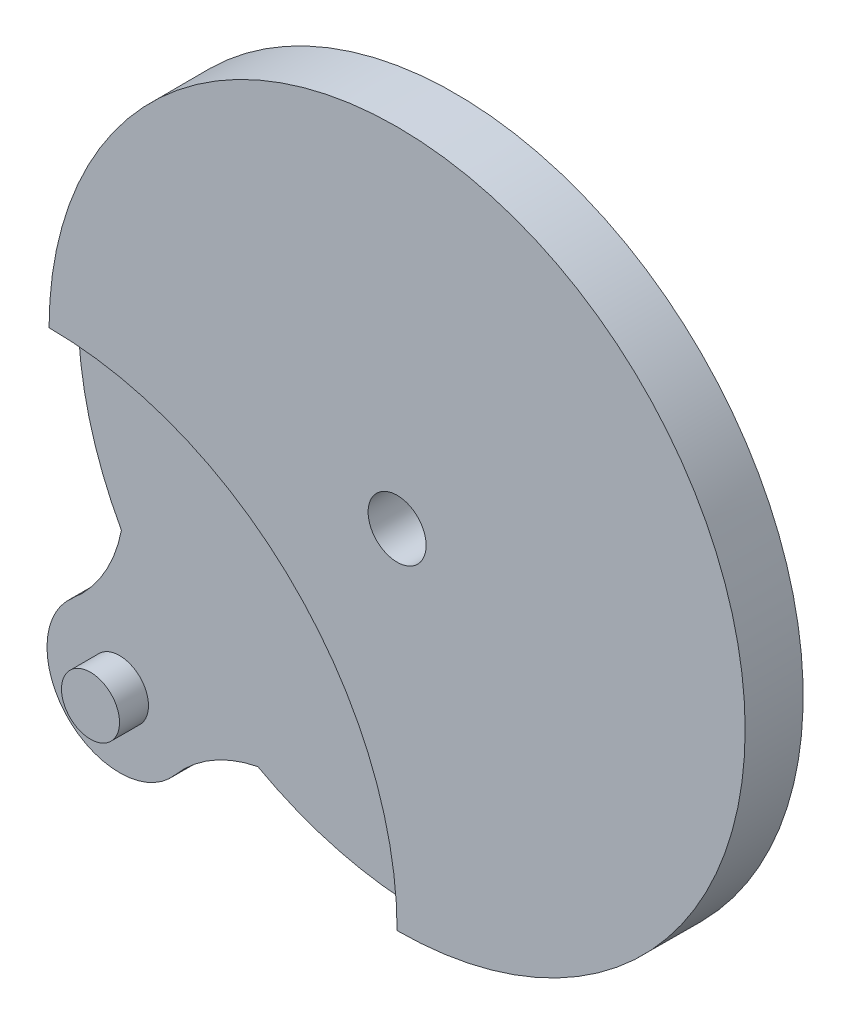
ISO-10303-21;
HEADER;
FILE_DESCRIPTION(('STEP AP214'),'2;1');
FILE_NAME('part.step','',(''),(''),'','','');
FILE_SCHEMA(('AUTOMOTIVE_DESIGN { 1 0 10303 214 1 1 1 1 }'));
ENDSEC;
DATA;
#1=APPLICATION_CONTEXT('core data for automotive mechanical design processes');
#2=APPLICATION_PROTOCOL_DEFINITION('international standard','automotive_design',2000,#1);
#3=PRODUCT_CONTEXT('',#1,'mechanical');
#4=PRODUCT('Part','Part','',(#3));
#5=PRODUCT_RELATED_PRODUCT_CATEGORY('part','',(#4));
#6=PRODUCT_DEFINITION_FORMATION('','',#4);
#7=PRODUCT_DEFINITION_CONTEXT('part definition',#1,'design');
#8=PRODUCT_DEFINITION('design','',#6,#7);
#9=PRODUCT_DEFINITION_SHAPE('','',#8);
#10=(LENGTH_UNIT() NAMED_UNIT(*) SI_UNIT(.MILLI.,.METRE.));
#11=(NAMED_UNIT(*) PLANE_ANGLE_UNIT() SI_UNIT($,.RADIAN.));
#12=(NAMED_UNIT(*) SI_UNIT($,.STERADIAN.) SOLID_ANGLE_UNIT());
#13=UNCERTAINTY_MEASURE_WITH_UNIT(LENGTH_MEASURE(1.E-05),#10,'distance_accuracy_value','');
#14=(GEOMETRIC_REPRESENTATION_CONTEXT(3) GLOBAL_UNCERTAINTY_ASSIGNED_CONTEXT((#13)) GLOBAL_UNIT_ASSIGNED_CONTEXT((#10,
#11,#12)) REPRESENTATION_CONTEXT('',''));
#15=CARTESIAN_POINT('',(0.,0.,0.));
#16=DIRECTION('',(0.,0.,1.));
#17=DIRECTION('',(1.,0.,0.));
#18=AXIS2_PLACEMENT_3D('',#15,#16,#17);
#19=CARTESIAN_POINT('',(0.,0.,10.));
#20=DIRECTION('',(0.,0.,-1.));
#21=DIRECTION('',(-1.,0.,0.));
#22=AXIS2_PLACEMENT_3D('',#19,#20,#21);
#23=CYLINDRICAL_SURFACE('',#22,5.);
#24=CARTESIAN_POINT('',(0.,0.,10.));
#25=DIRECTION('',(0.,0.,1.));
#26=DIRECTION('',(1.,0.,0.));
#27=AXIS2_PLACEMENT_3D('',#24,#25,#26);
#28=CIRCLE('',#27,5.);
#29=CARTESIAN_POINT('',(5.,0.,10.));
#30=VERTEX_POINT('',#29);
#31=EDGE_CURVE('E138',#30,#30,#28,.T.);
#32=ORIENTED_EDGE('',*,*,#31,.T.);
#33=EDGE_LOOP('',(#32));
#34=FACE_BOUND('',#33,.T.);
#35=CARTESIAN_POINT('',(0.,0.,0.));
#36=DIRECTION('',(0.,0.,1.));
#37=DIRECTION('',(1.,0.,0.));
#38=AXIS2_PLACEMENT_3D('',#35,#36,#37);
#39=CIRCLE('',#38,5.);
#40=CARTESIAN_POINT('',(5.,0.,0.));
#41=VERTEX_POINT('',#40);
#42=EDGE_CURVE('E136',#41,#41,#39,.T.);
#43=ORIENTED_EDGE('',*,*,#42,.F.);
#44=EDGE_LOOP('',(#43));
#45=FACE_BOUND('',#44,.T.);
#46=ADVANCED_FACE('F39',(#34,#45),#23,.F.);
#47=CARTESIAN_POINT('',(0.,0.,10.));
#48=DIRECTION('',(0.,0.,-1.));
#49=DIRECTION('',(-1.,0.,0.));
#50=AXIS2_PLACEMENT_3D('',#47,#48,#49);
#51=CYLINDRICAL_SURFACE('',#50,60.);
#52=CARTESIAN_POINT('',(0.,0.,0.));
#53=DIRECTION('',(0.,0.,1.));
#54=DIRECTION('',(1.,0.,0.));
#55=AXIS2_PLACEMENT_3D('',#52,#53,#54);
#56=CIRCLE('',#55,60.);
#57=CARTESIAN_POINT('',(-29.0017317235602,-52.5252278151618,0.));
#58=VERTEX_POINT('',#57);
#59=CARTESIAN_POINT('',(-52.5252278151621,-29.0017317235597,0.));
#60=VERTEX_POINT('',#59);
#61=EDGE_CURVE('E57',#58,#60,#56,.T.);
#62=ORIENTED_EDGE('',*,*,#61,.T.);
#63=DIRECTION('',(0.,0.,-1.));
#64=VECTOR('',#63,1.);
#65=CARTESIAN_POINT('',(-52.5252278151625,-29.0017317235599,5.));
#66=LINE('',#65,#64);
#67=CARTESIAN_POINT('',(-52.5252278151625,-29.0017317235599,5.));
#68=VERTEX_POINT('',#67);
#69=EDGE_CURVE('E101',#68,#60,#66,.T.);
#70=ORIENTED_EDGE('',*,*,#69,.F.);
#71=CARTESIAN_POINT('',(0.,0.,5.));
#72=DIRECTION('',(0.,0.,-1.));
#73=DIRECTION('',(-1.,0.,0.));
#74=AXIS2_PLACEMENT_3D('',#71,#72,#73);
#75=CIRCLE('',#74,60.);
#76=CARTESIAN_POINT('',(-60.,0.,5.));
#77=VERTEX_POINT('',#76);
#78=EDGE_CURVE('E90',#68,#77,#75,.T.);
#79=ORIENTED_EDGE('',*,*,#78,.T.);
#80=DIRECTION('',(0.,0.,1.));
#81=VECTOR('',#80,1.);
#82=CARTESIAN_POINT('',(-60.,0.,5.));
#83=LINE('',#82,#81);
#84=CARTESIAN_POINT('',(-60.,0.,10.));
#85=VERTEX_POINT('',#84);
#86=EDGE_CURVE('E132',#77,#85,#83,.T.);
#87=ORIENTED_EDGE('',*,*,#86,.T.);
#88=CARTESIAN_POINT('',(0.,0.,10.));
#89=DIRECTION('',(0.,0.,1.));
#90=DIRECTION('',(1.,0.,0.));
#91=AXIS2_PLACEMENT_3D('',#88,#89,#90);
#92=CIRCLE('',#91,60.);
#93=CARTESIAN_POINT('',(0.,-60.,10.));
#94=VERTEX_POINT('',#93);
#95=EDGE_CURVE('E100',#94,#85,#92,.T.);
#96=ORIENTED_EDGE('',*,*,#95,.F.);
#97=DIRECTION('',(0.,0.,1.));
#98=VECTOR('',#97,1.);
#99=CARTESIAN_POINT('',(0.,-60.,5.));
#100=LINE('',#99,#98);
#101=CARTESIAN_POINT('',(0.,-60.,5.));
#102=VERTEX_POINT('',#101);
#103=EDGE_CURVE('E134',#102,#94,#100,.T.);
#104=ORIENTED_EDGE('',*,*,#103,.F.);
#105=CARTESIAN_POINT('',(-29.0017317235602,-52.5252278151618,5.));
#106=VERTEX_POINT('',#105);
#107=EDGE_CURVE('E46',#102,#106,#75,.T.);
#108=ORIENTED_EDGE('',*,*,#107,.T.);
#109=DIRECTION('',(0.,0.,-1.));
#110=VECTOR('',#109,1.);
#111=CARTESIAN_POINT('',(-29.0017317235602,-52.5252278151619,5.));
#112=LINE('',#111,#110);
#113=EDGE_CURVE('E53',#106,#58,#112,.T.);
#114=ORIENTED_EDGE('',*,*,#113,.T.);
#115=EDGE_LOOP('',(#62,#70,#79,#87,#96,#104,#108,#114));
#116=FACE_BOUND('',#115,.T.);
#117=ADVANCED_FACE('F102',(#116),#51,.T.);
#118=CARTESIAN_POINT('',(0.,0.,10.));
#119=DIRECTION('',(0.,0.,1.));
#120=DIRECTION('',(1.,0.,0.));
#121=AXIS2_PLACEMENT_3D('',#118,#119,#120);
#122=PLANE('',#121);
#123=CARTESIAN_POINT('',(-60.,-60.,10.));
#124=DIRECTION('',(0.,0.,1.));
#125=DIRECTION('',(-1.,0.,0.));
#126=AXIS2_PLACEMENT_3D('',#123,#124,#125);
#127=CIRCLE('',#126,60.);
#128=EDGE_CURVE('E127',#94,#85,#127,.T.);
#129=ORIENTED_EDGE('',*,*,#128,.F.);
#130=ORIENTED_EDGE('',*,*,#95,.T.);
#131=EDGE_LOOP('',(#129,#130));
#132=FACE_BOUND('',#131,.T.);
#133=ORIENTED_EDGE('',*,*,#31,.F.);
#134=EDGE_LOOP('',(#133));
#135=FACE_BOUND('',#134,.T.);
#136=ADVANCED_FACE('F157',(#132,#135),#122,.T.);
#137=CARTESIAN_POINT('',(0.,0.,0.));
#138=DIRECTION('',(0.,0.,1.));
#139=DIRECTION('',(1.,0.,0.));
#140=AXIS2_PLACEMENT_3D('',#137,#138,#139);
#141=PLANE('',#140);
#142=ORIENTED_EDGE('',*,*,#42,.T.);
#143=EDGE_LOOP('',(#142));
#144=FACE_BOUND('',#143,.T.);
#145=ORIENTED_EDGE('',*,*,#61,.F.);
#146=CARTESIAN_POINT('',(-24.2154792278154,-77.0627865170166,0.));
#147=DIRECTION('',(0.,0.,1.));
#148=DIRECTION('',(-1.,0.,0.));
#149=AXIS2_PLACEMENT_3D('',#146,#147,#148);
#150=CIRCLE('',#149,24.9999999999998);
#151=CARTESIAN_POINT('',(-43.3093143384008,-60.9250834348021,0.));
#152=VERTEX_POINT('',#151);
#153=EDGE_CURVE('E116',#58,#152,#150,.T.);
#154=ORIENTED_EDGE('',*,*,#153,.T.);
#155=CARTESIAN_POINT('',(-52.8562318936947,-52.8562318936941,0.));
#156=DIRECTION('',(0.,0.,-1.));
#157=DIRECTION('',(-1.,0.,0.));
#158=AXIS2_PLACEMENT_3D('',#155,#156,#157);
#159=CIRCLE('',#158,12.5000000000008);
#160=CARTESIAN_POINT('',(-60.9250834348031,-43.3093143384006,0.));
#161=VERTEX_POINT('',#160);
#162=EDGE_CURVE('E111',#152,#161,#159,.T.);
#163=ORIENTED_EDGE('',*,*,#162,.T.);
#164=CARTESIAN_POINT('',(-77.0627865170168,-24.2154792278139,0.));
#165=DIRECTION('',(0.,0.,1.));
#166=DIRECTION('',(1.,0.,0.));
#167=AXIS2_PLACEMENT_3D('',#164,#165,#166);
#168=CIRCLE('',#167,24.9999999999992);
#169=EDGE_CURVE('E122',#161,#60,#168,.T.);
#170=ORIENTED_EDGE('',*,*,#169,.T.);
#171=EDGE_LOOP('',(#145,#154,#163,#170));
#172=FACE_BOUND('',#171,.T.);
#173=ADVANCED_FACE('F155',(#144,#172),#141,.F.);
#174=CARTESIAN_POINT('',(-60.,-60.,5.));
#175=DIRECTION('',(0.,0.,-1.));
#176=DIRECTION('',(-1.,0.,0.));
#177=AXIS2_PLACEMENT_3D('',#174,#175,#176);
#178=PLANE('',#177);
#179=CARTESIAN_POINT('',(-52.8562318936947,-52.8562318936941,5.));
#180=DIRECTION('',(0.,0.,-1.));
#181=DIRECTION('',(-1.,0.,0.));
#182=AXIS2_PLACEMENT_3D('',#179,#180,#181);
#183=CIRCLE('',#182,5.);
#184=CARTESIAN_POINT('',(-57.8562318936947,-52.8562318936941,5.));
#185=VERTEX_POINT('',#184);
#186=EDGE_CURVE('E11',#185,#185,#183,.F.);
#187=ORIENTED_EDGE('',*,*,#186,.F.);
#188=EDGE_LOOP('',(#187));
#189=FACE_BOUND('',#188,.T.);
#190=CARTESIAN_POINT('',(-60.,-60.,5.));
#191=DIRECTION('',(0.,0.,1.));
#192=DIRECTION('',(-1.,0.,0.));
#193=AXIS2_PLACEMENT_3D('',#190,#191,#192);
#194=CIRCLE('',#193,60.);
#195=EDGE_CURVE('E97',#102,#77,#194,.T.);
#196=ORIENTED_EDGE('',*,*,#195,.T.);
#197=ORIENTED_EDGE('',*,*,#78,.F.);
#198=CARTESIAN_POINT('',(-77.0627865170168,-24.2154792278139,5.));
#199=DIRECTION('',(0.,0.,1.));
#200=DIRECTION('',(1.,0.,0.));
#201=AXIS2_PLACEMENT_3D('',#198,#199,#200);
#202=CIRCLE('',#201,24.9999999999992);
#203=CARTESIAN_POINT('',(-60.9250834348031,-43.3093143384006,5.));
#204=VERTEX_POINT('',#203);
#205=EDGE_CURVE('E94',#204,#68,#202,.T.);
#206=ORIENTED_EDGE('',*,*,#205,.F.);
#207=CARTESIAN_POINT('',(-52.8562318936947,-52.8562318936941,5.));
#208=DIRECTION('',(0.,0.,-1.));
#209=DIRECTION('',(-1.,0.,0.));
#210=AXIS2_PLACEMENT_3D('',#207,#208,#209);
#211=CIRCLE('',#210,12.5000000000008);
#212=CARTESIAN_POINT('',(-43.3093143384008,-60.9250834348021,5.));
#213=VERTEX_POINT('',#212);
#214=EDGE_CURVE('E106',#213,#204,#211,.T.);
#215=ORIENTED_EDGE('',*,*,#214,.F.);
#216=CARTESIAN_POINT('',(-24.2154792278154,-77.0627865170166,5.));
#217=DIRECTION('',(0.,0.,1.));
#218=DIRECTION('',(-1.,0.,0.));
#219=AXIS2_PLACEMENT_3D('',#216,#217,#218);
#220=CIRCLE('',#219,24.9999999999998);
#221=EDGE_CURVE('E110',#106,#213,#220,.T.);
#222=ORIENTED_EDGE('',*,*,#221,.F.);
#223=ORIENTED_EDGE('',*,*,#107,.F.);
#224=EDGE_LOOP('',(#196,#197,#206,#215,#222,#223));
#225=FACE_BOUND('',#224,.T.);
#226=ADVANCED_FACE('F91',(#189,#225),#178,.F.);
#227=CARTESIAN_POINT('',(-60.,-60.,5.));
#228=DIRECTION('',(0.,0.,1.));
#229=DIRECTION('',(1.,0.,0.));
#230=AXIS2_PLACEMENT_3D('',#227,#228,#229);
#231=CYLINDRICAL_SURFACE('',#230,60.);
#232=ORIENTED_EDGE('',*,*,#128,.T.);
#233=ORIENTED_EDGE('',*,*,#86,.F.);
#234=ORIENTED_EDGE('',*,*,#195,.F.);
#235=ORIENTED_EDGE('',*,*,#103,.T.);
#236=EDGE_LOOP('',(#232,#233,#234,#235));
#237=FACE_BOUND('',#236,.T.);
#238=ADVANCED_FACE('F165',(#237),#231,.F.);
#239=CARTESIAN_POINT('',(-77.0627865170168,-24.2154792278139,5.));
#240=DIRECTION('',(0.,0.,-1.));
#241=DIRECTION('',(-1.,0.,0.));
#242=AXIS2_PLACEMENT_3D('',#239,#240,#241);
#243=CYLINDRICAL_SURFACE('',#242,24.9999999999992);
#244=ORIENTED_EDGE('',*,*,#169,.F.);
#245=DIRECTION('',(0.,0.,-1.));
#246=VECTOR('',#245,1.);
#247=CARTESIAN_POINT('',(-60.9250834348031,-43.3093143384006,5.));
#248=LINE('',#247,#246);
#249=EDGE_CURVE('E109',#204,#161,#248,.T.);
#250=ORIENTED_EDGE('',*,*,#249,.F.);
#251=ORIENTED_EDGE('',*,*,#205,.T.);
#252=ORIENTED_EDGE('',*,*,#69,.T.);
#253=EDGE_LOOP('',(#244,#250,#251,#252));
#254=FACE_BOUND('',#253,.T.);
#255=ADVANCED_FACE('F108',(#254),#243,.F.);
#256=CARTESIAN_POINT('',(-52.8562318936947,-52.8562318936941,5.));
#257=DIRECTION('',(0.,0.,-1.));
#258=DIRECTION('',(-1.,0.,0.));
#259=AXIS2_PLACEMENT_3D('',#256,#257,#258);
#260=CYLINDRICAL_SURFACE('',#259,12.5000000000008);
#261=ORIENTED_EDGE('',*,*,#162,.F.);
#262=DIRECTION('',(0.,0.,-1.));
#263=VECTOR('',#262,1.);
#264=CARTESIAN_POINT('',(-43.3093143384008,-60.9250834348021,5.));
#265=LINE('',#264,#263);
#266=EDGE_CURVE('E128',#213,#152,#265,.T.);
#267=ORIENTED_EDGE('',*,*,#266,.F.);
#268=ORIENTED_EDGE('',*,*,#214,.T.);
#269=ORIENTED_EDGE('',*,*,#249,.T.);
#270=EDGE_LOOP('',(#261,#267,#268,#269));
#271=FACE_BOUND('',#270,.T.);
#272=ADVANCED_FACE('F153',(#271),#260,.T.);
#273=CARTESIAN_POINT('',(-24.2154792278154,-77.0627865170166,5.));
#274=DIRECTION('',(0.,0.,-1.));
#275=DIRECTION('',(-1.,0.,0.));
#276=AXIS2_PLACEMENT_3D('',#273,#274,#275);
#277=CYLINDRICAL_SURFACE('',#276,24.9999999999998);
#278=ORIENTED_EDGE('',*,*,#153,.F.);
#279=ORIENTED_EDGE('',*,*,#113,.F.);
#280=ORIENTED_EDGE('',*,*,#221,.T.);
#281=ORIENTED_EDGE('',*,*,#266,.T.);
#282=EDGE_LOOP('',(#278,#279,#280,#281));
#283=FACE_BOUND('',#282,.T.);
#284=ADVANCED_FACE('F150',(#283),#277,.F.);
#285=CARTESIAN_POINT('',(-52.8562318936947,-52.8562318936941,10.));
#286=DIRECTION('',(0.,0.,-1.));
#287=DIRECTION('',(-1.,0.,0.));
#288=AXIS2_PLACEMENT_3D('',#285,#286,#287);
#289=CYLINDRICAL_SURFACE('',#288,5.);
#290=CARTESIAN_POINT('',(-52.8562318936947,-52.8562318936941,10.));
#291=DIRECTION('',(0.,0.,1.));
#292=DIRECTION('',(1.,0.,0.));
#293=AXIS2_PLACEMENT_3D('',#290,#291,#292);
#294=CIRCLE('',#293,5.);
#295=CARTESIAN_POINT('',(-47.8562318936947,-52.8562318936941,10.));
#296=VERTEX_POINT('',#295);
#297=EDGE_CURVE('E119',#296,#296,#294,.T.);
#298=ORIENTED_EDGE('',*,*,#297,.F.);
#299=EDGE_LOOP('',(#298));
#300=FACE_BOUND('',#299,.T.);
#301=ORIENTED_EDGE('',*,*,#186,.T.);
#302=EDGE_LOOP('',(#301));
#303=FACE_BOUND('',#302,.T.);
#304=ADVANCED_FACE('F223',(#300,#303),#289,.T.);
#305=CARTESIAN_POINT('',(-52.8562318936947,-52.8562318936941,10.));
#306=DIRECTION('',(0.,0.,1.));
#307=DIRECTION('',(1.,0.,0.));
#308=AXIS2_PLACEMENT_3D('',#305,#306,#307);
#309=PLANE('',#308);
#310=ORIENTED_EDGE('',*,*,#297,.T.);
#311=EDGE_LOOP('',(#310));
#312=FACE_BOUND('',#311,.T.);
#313=ADVANCED_FACE('F229',(#312),#309,.T.);
#314=CLOSED_SHELL('',(#46,#117,#136,#173,#226,#238,#255,#272,#284,#304,#313));
#315=MANIFOLD_SOLID_BREP('B2',#314);
#316=ADVANCED_BREP_SHAPE_REPRESENTATION('',(#18,#315),#14);
#317=SHAPE_DEFINITION_REPRESENTATION(#9,#316);
ENDSEC;
END-ISO-10303-21;
